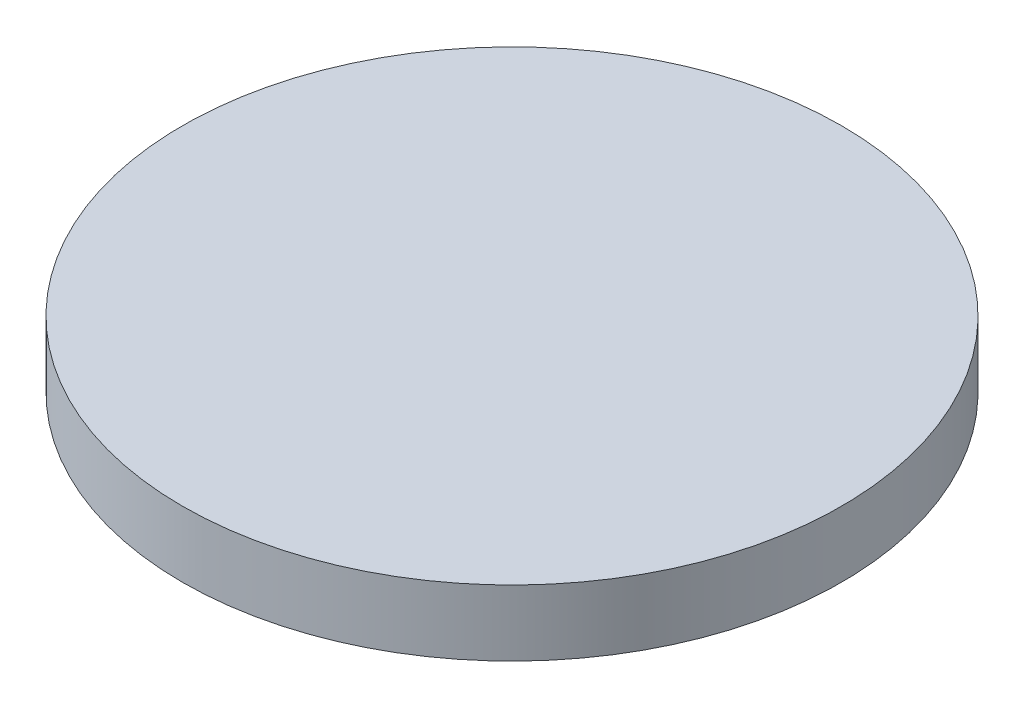
ISO-10303-21;
HEADER;
FILE_DESCRIPTION(('STEP AP214'),'2;1');
FILE_NAME('part.step','',(''),(''),'','','');
FILE_SCHEMA(('AUTOMOTIVE_DESIGN { 1 0 10303 214 1 1 1 1 }'));
ENDSEC;
DATA;
#1=APPLICATION_CONTEXT('core data for automotive mechanical design processes');
#2=APPLICATION_PROTOCOL_DEFINITION('international standard','automotive_design',2000,#1);
#3=PRODUCT_CONTEXT('',#1,'mechanical');
#4=PRODUCT('Part','Part','',(#3));
#5=PRODUCT_RELATED_PRODUCT_CATEGORY('part','',(#4));
#6=PRODUCT_DEFINITION_FORMATION('','',#4);
#7=PRODUCT_DEFINITION_CONTEXT('part definition',#1,'design');
#8=PRODUCT_DEFINITION('design','',#6,#7);
#9=PRODUCT_DEFINITION_SHAPE('','',#8);
#10=(LENGTH_UNIT() NAMED_UNIT(*) SI_UNIT(.MILLI.,.METRE.));
#11=(NAMED_UNIT(*) PLANE_ANGLE_UNIT() SI_UNIT($,.RADIAN.));
#12=(NAMED_UNIT(*) SI_UNIT($,.STERADIAN.) SOLID_ANGLE_UNIT());
#13=UNCERTAINTY_MEASURE_WITH_UNIT(LENGTH_MEASURE(1.E-05),#10,'distance_accuracy_value','');
#14=(GEOMETRIC_REPRESENTATION_CONTEXT(3) GLOBAL_UNCERTAINTY_ASSIGNED_CONTEXT((#13)) GLOBAL_UNIT_ASSIGNED_CONTEXT((#10,
#11,#12)) REPRESENTATION_CONTEXT('',''));
#15=CARTESIAN_POINT('',(0.,0.,0.));
#16=DIRECTION('',(0.,0.,1.));
#17=DIRECTION('',(1.,0.,0.));
#18=AXIS2_PLACEMENT_3D('',#15,#16,#17);
#19=CARTESIAN_POINT('',(0.,19.05,0.));
#20=DIRECTION('',(0.,-1.,0.));
#21=DIRECTION('',(0.,0.,-1.));
#22=AXIS2_PLACEMENT_3D('',#19,#20,#21);
#23=CYLINDRICAL_SURFACE('',#22,95.25);
#24=CARTESIAN_POINT('',(0.,19.05,0.));
#25=DIRECTION('',(0.,1.,0.));
#26=DIRECTION('',(0.,0.,1.));
#27=AXIS2_PLACEMENT_3D('',#24,#25,#26);
#28=CIRCLE('',#27,95.25);
#29=CARTESIAN_POINT('',(0.,19.05,-95.25));
#30=VERTEX_POINT('',#29);
#31=EDGE_CURVE('E10',#30,#30,#28,.T.);
#32=CARTESIAN_POINT('',(0.,0.,0.));
#33=DIRECTION('',(0.,1.,0.));
#34=DIRECTION('',(0.,0.,1.));
#35=AXIS2_PLACEMENT_3D('',#32,#33,#34);
#36=CIRCLE('',#35,95.25);
#37=CARTESIAN_POINT('',(0.,0.,-95.25));
#38=VERTEX_POINT('',#37);
#39=EDGE_CURVE('E35',#38,#38,#36,.T.);
#40=CARTESIAN_POINT('',(0.,19.05,-95.25));
#41=CARTESIAN_POINT('',(0.,18.8515625,-95.25));
#42=CARTESIAN_POINT('',(0.,18.653125,-95.25));
#43=CARTESIAN_POINT('',(0.,18.25625,-95.25));
#44=CARTESIAN_POINT('',(0.,18.0578125,-95.25));
#45=CARTESIAN_POINT('',(0.,17.6609375,-95.25));
#46=CARTESIAN_POINT('',(0.,17.4625,-95.25));
#47=CARTESIAN_POINT('',(0.,17.065625,-95.25));
#48=CARTESIAN_POINT('',(0.,16.8671875,-95.25));
#49=CARTESIAN_POINT('',(0.,16.4703125,-95.25));
#50=CARTESIAN_POINT('',(0.,16.271875,-95.25));
#51=CARTESIAN_POINT('',(0.,15.875,-95.25));
#52=CARTESIAN_POINT('',(0.,15.6765625,-95.25));
#53=CARTESIAN_POINT('',(0.,15.2796875,-95.25));
#54=CARTESIAN_POINT('',(0.,15.08125,-95.25));
#55=CARTESIAN_POINT('',(0.,14.684375,-95.25));
#56=CARTESIAN_POINT('',(0.,14.4859375,-95.25));
#57=CARTESIAN_POINT('',(0.,14.0890625,-95.25));
#58=CARTESIAN_POINT('',(0.,13.890625,-95.25));
#59=CARTESIAN_POINT('',(0.,13.49375,-95.25));
#60=CARTESIAN_POINT('',(0.,13.2953125,-95.25));
#61=CARTESIAN_POINT('',(0.,12.8984375,-95.25));
#62=CARTESIAN_POINT('',(0.,12.7,-95.25));
#63=CARTESIAN_POINT('',(0.,12.303125,-95.25));
#64=CARTESIAN_POINT('',(0.,12.1046875,-95.25));
#65=CARTESIAN_POINT('',(0.,11.7078125,-95.25));
#66=CARTESIAN_POINT('',(0.,11.509375,-95.25));
#67=CARTESIAN_POINT('',(0.,11.1125,-95.25));
#68=CARTESIAN_POINT('',(0.,10.9140625,-95.25));
#69=CARTESIAN_POINT('',(0.,10.5171875,-95.25));
#70=CARTESIAN_POINT('',(0.,10.31875,-95.25));
#71=CARTESIAN_POINT('',(0.,9.921875,-95.25));
#72=CARTESIAN_POINT('',(0.,9.7234375,-95.25));
#73=CARTESIAN_POINT('',(0.,9.3265625,-95.25));
#74=CARTESIAN_POINT('',(0.,9.128125,-95.25));
#75=CARTESIAN_POINT('',(0.,8.73125,-95.25));
#76=CARTESIAN_POINT('',(0.,8.5328125,-95.25));
#77=CARTESIAN_POINT('',(0.,8.1359375,-95.25));
#78=CARTESIAN_POINT('',(0.,7.9375,-95.25));
#79=CARTESIAN_POINT('',(0.,7.540625,-95.25));
#80=CARTESIAN_POINT('',(0.,7.3421875,-95.25));
#81=CARTESIAN_POINT('',(0.,6.9453125,-95.25));
#82=CARTESIAN_POINT('',(0.,6.746875,-95.25));
#83=CARTESIAN_POINT('',(0.,6.35,-95.25));
#84=CARTESIAN_POINT('',(0.,6.1515625,-95.25));
#85=CARTESIAN_POINT('',(0.,5.7546875,-95.25));
#86=CARTESIAN_POINT('',(0.,5.55625,-95.25));
#87=CARTESIAN_POINT('',(0.,5.159375,-95.25));
#88=CARTESIAN_POINT('',(0.,4.9609375,-95.25));
#89=CARTESIAN_POINT('',(0.,4.5640625,-95.25));
#90=CARTESIAN_POINT('',(0.,4.365625,-95.25));
#91=CARTESIAN_POINT('',(0.,3.96875,-95.25));
#92=CARTESIAN_POINT('',(0.,3.7703125,-95.25));
#93=CARTESIAN_POINT('',(0.,3.3734375,-95.25));
#94=CARTESIAN_POINT('',(0.,3.175,-95.25));
#95=CARTESIAN_POINT('',(0.,2.778125,-95.25));
#96=CARTESIAN_POINT('',(0.,2.5796875,-95.25));
#97=CARTESIAN_POINT('',(0.,2.1828125,-95.25));
#98=CARTESIAN_POINT('',(0.,1.984375,-95.25));
#99=CARTESIAN_POINT('',(0.,1.5875,-95.25));
#100=CARTESIAN_POINT('',(0.,1.3890625,-95.25));
#101=CARTESIAN_POINT('',(0.,0.992187500000001,-95.25));
#102=CARTESIAN_POINT('',(0.,0.793750000000001,-95.25));
#103=CARTESIAN_POINT('',(0.,0.396875,-95.25));
#104=CARTESIAN_POINT('',(0.,0.1984375,-95.25));
#105=CARTESIAN_POINT('',(0.,0.,-95.25));
#106=B_SPLINE_CURVE_WITH_KNOTS('',3,(#40,#41,#42,#43,#44,#45,#46,#47,#48,#49,#50,#51,#52,#53,
#54,#55,#56,#57,#58,#59,#60,#61,#62,#63,#64,#65,#66,#67,#68,#69,#70,#71,#72,#73,#74,#75,#76,#77,
#78,#79,#80,#81,#82,#83,#84,#85,#86,#87,#88,#89,#90,#91,#92,#93,#94,#95,#96,#97,#98,#99,#100,
#101,#102,#103,#104,#105),.UNSPECIFIED.,.F.,.F.,(4,2,2,2,2,2,2,2,2,2,2,2,2,2,2,2,2,2,2,2,2,2,2,
2,2,2,2,2,2,2,2,2,4),(0.,0.595312499999997,1.190625,1.7859375,2.38125,2.9765625,3.571875,
4.1671875,4.7625,5.3578125,5.953125,6.5484375,7.14375,7.7390625,8.334375,8.9296875,9.525,
10.1203125,10.715625,11.3109375,11.90625,12.5015625,13.096875,13.6921875,14.2875,14.8828125,
15.478125,16.0734375,16.66875,17.2640625,17.859375,18.4546875,19.05),.UNSPECIFIED.);
#107=EDGE_CURVE('BSEAM32',#30,#38,#106,.T.);
#108=ORIENTED_EDGE('',*,*,#31,.F.);
#109=ORIENTED_EDGE('',*,*,#39,.T.);
#110=ORIENTED_EDGE('',*,*,#107,.T.);
#111=ORIENTED_EDGE('',*,*,#107,.F.);
#112=EDGE_LOOP('',(#108,#110,#109,#111));
#113=FACE_BOUND('',#112,.T.);
#114=ADVANCED_FACE('F32',(#113),#23,.T.);
#115=CARTESIAN_POINT('',(0.,19.05,0.));
#116=DIRECTION('',(0.,1.,0.));
#117=DIRECTION('',(0.,0.,1.));
#118=AXIS2_PLACEMENT_3D('',#115,#116,#117);
#119=PLANE('',#118);
#120=ORIENTED_EDGE('',*,*,#31,.T.);
#121=EDGE_LOOP('',(#120));
#122=FACE_BOUND('',#121,.T.);
#123=ADVANCED_FACE('F53',(#122),#119,.T.);
#124=CARTESIAN_POINT('',(0.,0.,0.));
#125=DIRECTION('',(0.,1.,0.));
#126=DIRECTION('',(0.,0.,1.));
#127=AXIS2_PLACEMENT_3D('',#124,#125,#126);
#128=PLANE('',#127);
#129=ORIENTED_EDGE('',*,*,#39,.F.);
#130=EDGE_LOOP('',(#129));
#131=FACE_BOUND('',#130,.T.);
#132=ADVANCED_FACE('F51',(#131),#128,.F.);
#133=CLOSED_SHELL('',(#114,#123,#132));
#134=MANIFOLD_SOLID_BREP('B2',#133);
#135=ADVANCED_BREP_SHAPE_REPRESENTATION('',(#18,#134),#14);
#136=SHAPE_DEFINITION_REPRESENTATION(#9,#135);
ENDSEC;
END-ISO-10303-21;
